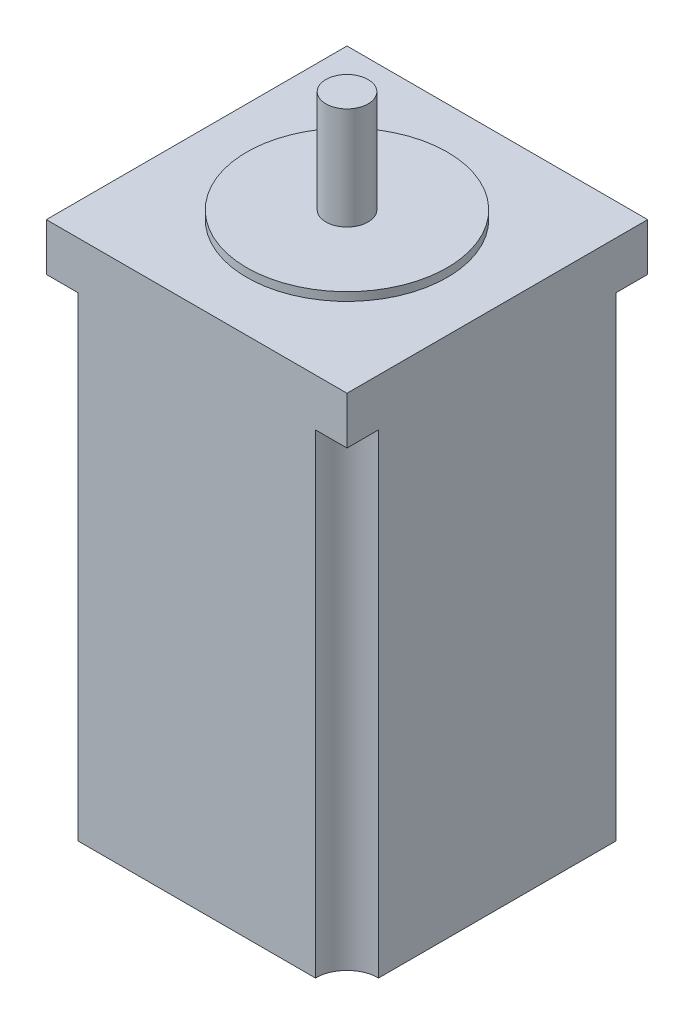
ISO-10303-21;
HEADER;
FILE_DESCRIPTION(('STEP AP214'),'2;1');
FILE_NAME('part.step','',(''),(''),'','','');
FILE_SCHEMA(('AUTOMOTIVE_DESIGN { 1 0 10303 214 1 1 1 1 }'));
ENDSEC;
DATA;
#1=APPLICATION_CONTEXT('core data for automotive mechanical design processes');
#2=APPLICATION_PROTOCOL_DEFINITION('international standard','automotive_design',2000,#1);
#3=PRODUCT_CONTEXT('',#1,'mechanical');
#4=PRODUCT('Part','Part','',(#3));
#5=PRODUCT_RELATED_PRODUCT_CATEGORY('part','',(#4));
#6=PRODUCT_DEFINITION_FORMATION('','',#4);
#7=PRODUCT_DEFINITION_CONTEXT('part definition',#1,'design');
#8=PRODUCT_DEFINITION('design','',#6,#7);
#9=PRODUCT_DEFINITION_SHAPE('','',#8);
#10=(LENGTH_UNIT() NAMED_UNIT(*) SI_UNIT(.MILLI.,.METRE.));
#11=(NAMED_UNIT(*) PLANE_ANGLE_UNIT() SI_UNIT($,.RADIAN.));
#12=(NAMED_UNIT(*) SI_UNIT($,.STERADIAN.) SOLID_ANGLE_UNIT());
#13=UNCERTAINTY_MEASURE_WITH_UNIT(LENGTH_MEASURE(1.E-05),#10,'distance_accuracy_value','');
#14=(GEOMETRIC_REPRESENTATION_CONTEXT(3) GLOBAL_UNCERTAINTY_ASSIGNED_CONTEXT((#13)) GLOBAL_UNIT_ASSIGNED_CONTEXT((#10,
#11,#12)) REPRESENTATION_CONTEXT('',''));
#15=CARTESIAN_POINT('',(0.,0.,0.));
#16=DIRECTION('',(0.,0.,1.));
#17=DIRECTION('',(1.,0.,0.));
#18=AXIS2_PLACEMENT_3D('',#15,#16,#17);
#19=CARTESIAN_POINT('',(-28.5,99.,28.5));
#20=DIRECTION('',(1.,0.,0.));
#21=DIRECTION('',(0.,0.,-1.));
#22=AXIS2_PLACEMENT_3D('',#19,#20,#21);
#23=PLANE('',#22);
#24=DIRECTION('',(0.,0.,1.));
#25=VECTOR('',#24,1.);
#26=CARTESIAN_POINT('',(-28.5,0.,28.5));
#27=LINE('',#26,#25);
#28=CARTESIAN_POINT('',(-28.4999999999998,0.,-22.5000000000003));
#29=VERTEX_POINT('',#28);
#30=CARTESIAN_POINT('',(-28.5,0.,22.5));
#31=VERTEX_POINT('',#30);
#32=EDGE_CURVE('E200',#29,#31,#27,.T.);
#33=ORIENTED_EDGE('',*,*,#32,.T.);
#34=DIRECTION('',(0.,-1.,0.));
#35=VECTOR('',#34,1.);
#36=CARTESIAN_POINT('',(-28.5,90.,22.5));
#37=LINE('',#36,#35);
#38=CARTESIAN_POINT('',(-28.5,90.,22.5));
#39=VERTEX_POINT('',#38);
#40=EDGE_CURVE('E60',#39,#31,#37,.T.);
#41=ORIENTED_EDGE('',*,*,#40,.F.);
#42=DIRECTION('',(0.,0.,-1.));
#43=VECTOR('',#42,1.);
#44=CARTESIAN_POINT('',(-28.5,90.,0.));
#45=LINE('',#44,#43);
#46=CARTESIAN_POINT('',(-28.5,90.,28.5));
#47=VERTEX_POINT('',#46);
#48=EDGE_CURVE('E156',#47,#39,#45,.T.);
#49=ORIENTED_EDGE('',*,*,#48,.F.);
#50=DIRECTION('',(0.,-1.,0.));
#51=VECTOR('',#50,1.);
#52=CARTESIAN_POINT('',(-28.5,99.,28.5));
#53=LINE('',#52,#51);
#54=CARTESIAN_POINT('',(-28.5,99.,28.5));
#55=VERTEX_POINT('',#54);
#56=EDGE_CURVE('E45',#55,#47,#53,.T.);
#57=ORIENTED_EDGE('',*,*,#56,.F.);
#58=DIRECTION('',(0.,0.,1.));
#59=VECTOR('',#58,1.);
#60=CARTESIAN_POINT('',(-28.5,99.,28.5));
#61=LINE('',#60,#59);
#62=CARTESIAN_POINT('',(-28.5,99.,-28.5));
#63=VERTEX_POINT('',#62);
#64=EDGE_CURVE('E203',#63,#55,#61,.T.);
#65=ORIENTED_EDGE('',*,*,#64,.F.);
#66=DIRECTION('',(0.,-1.,0.));
#67=VECTOR('',#66,1.);
#68=CARTESIAN_POINT('',(-28.5,99.,-28.5));
#69=LINE('',#68,#67);
#70=CARTESIAN_POINT('',(-28.4999999999997,90.,-28.5000000000003));
#71=VERTEX_POINT('',#70);
#72=EDGE_CURVE('E213',#63,#71,#69,.T.);
#73=ORIENTED_EDGE('',*,*,#72,.T.);
#74=DIRECTION('',(0.,0.,-1.));
#75=VECTOR('',#74,1.);
#76=CARTESIAN_POINT('',(-28.5,90.,-2.95052207519134E-13));
#77=LINE('',#76,#75);
#78=CARTESIAN_POINT('',(-28.4999999999998,90.,-22.5000000000003));
#79=VERTEX_POINT('',#78);
#80=EDGE_CURVE('E177',#79,#71,#77,.T.);
#81=ORIENTED_EDGE('',*,*,#80,.F.);
#82=DIRECTION('',(0.,-1.,0.));
#83=VECTOR('',#82,1.);
#84=CARTESIAN_POINT('',(-28.4999999999998,90.,-22.5000000000003));
#85=LINE('',#84,#83);
#86=EDGE_CURVE('E166',#79,#29,#85,.T.);
#87=ORIENTED_EDGE('',*,*,#86,.T.);
#88=EDGE_LOOP('',(#33,#41,#49,#57,#65,#73,#81,#87));
#89=FACE_BOUND('',#88,.T.);
#90=ADVANCED_FACE('F38',(#89),#23,.F.);
#91=CARTESIAN_POINT('',(-28.5,99.,28.5));
#92=DIRECTION('',(0.,0.,-1.));
#93=DIRECTION('',(-1.,0.,0.));
#94=AXIS2_PLACEMENT_3D('',#91,#92,#93);
#95=PLANE('',#94);
#96=DIRECTION('',(1.,0.,0.));
#97=VECTOR('',#96,1.);
#98=CARTESIAN_POINT('',(-28.5,0.,28.5));
#99=LINE('',#98,#97);
#100=CARTESIAN_POINT('',(-22.5,0.,28.5));
#101=VERTEX_POINT('',#100);
#102=CARTESIAN_POINT('',(22.4999999999999,0.,28.5));
#103=VERTEX_POINT('',#102);
#104=EDGE_CURVE('E149',#101,#103,#99,.T.);
#105=ORIENTED_EDGE('',*,*,#104,.T.);
#106=DIRECTION('',(0.,-1.,0.));
#107=VECTOR('',#106,1.);
#108=CARTESIAN_POINT('',(22.4999999999999,90.,28.5000000000001));
#109=LINE('',#108,#107);
#110=CARTESIAN_POINT('',(22.4999999999999,90.,28.5000000000001));
#111=VERTEX_POINT('',#110);
#112=EDGE_CURVE('E129',#111,#103,#109,.T.);
#113=ORIENTED_EDGE('',*,*,#112,.F.);
#114=DIRECTION('',(-1.,0.,0.));
#115=VECTOR('',#114,1.);
#116=CARTESIAN_POINT('',(0.,90.,28.5));
#117=LINE('',#116,#115);
#118=CARTESIAN_POINT('',(28.4999999999999,90.,28.5000000000001));
#119=VERTEX_POINT('',#118);
#120=EDGE_CURVE('E136',#119,#111,#117,.T.);
#121=ORIENTED_EDGE('',*,*,#120,.F.);
#122=DIRECTION('',(0.,-1.,0.));
#123=VECTOR('',#122,1.);
#124=CARTESIAN_POINT('',(28.5,99.,28.5));
#125=LINE('',#124,#123);
#126=CARTESIAN_POINT('',(28.5,99.,28.5));
#127=VERTEX_POINT('',#126);
#128=EDGE_CURVE('E226',#127,#119,#125,.T.);
#129=ORIENTED_EDGE('',*,*,#128,.F.);
#130=DIRECTION('',(1.,0.,0.));
#131=VECTOR('',#130,1.);
#132=CARTESIAN_POINT('',(-28.5,99.,28.5));
#133=LINE('',#132,#131);
#134=EDGE_CURVE('E206',#55,#127,#133,.T.);
#135=ORIENTED_EDGE('',*,*,#134,.F.);
#136=ORIENTED_EDGE('',*,*,#56,.T.);
#137=DIRECTION('',(-1.,0.,0.));
#138=VECTOR('',#137,1.);
#139=CARTESIAN_POINT('',(0.,90.,28.5));
#140=LINE('',#139,#138);
#141=CARTESIAN_POINT('',(-22.5,90.,28.5));
#142=VERTEX_POINT('',#141);
#143=EDGE_CURVE('E163',#142,#47,#140,.T.);
#144=ORIENTED_EDGE('',*,*,#143,.F.);
#145=DIRECTION('',(0.,-1.,0.));
#146=VECTOR('',#145,1.);
#147=CARTESIAN_POINT('',(-22.5,90.,28.5));
#148=LINE('',#147,#146);
#149=EDGE_CURVE('E167',#142,#101,#148,.T.);
#150=ORIENTED_EDGE('',*,*,#149,.T.);
#151=EDGE_LOOP('',(#105,#113,#121,#129,#135,#136,#144,#150));
#152=FACE_BOUND('',#151,.T.);
#153=ADVANCED_FACE('F146',(#152),#95,.F.);
#154=CARTESIAN_POINT('',(28.5,99.,28.5));
#155=DIRECTION('',(-1.,0.,0.));
#156=DIRECTION('',(0.,0.,1.));
#157=AXIS2_PLACEMENT_3D('',#154,#155,#156);
#158=PLANE('',#157);
#159=DIRECTION('',(0.,0.,1.));
#160=VECTOR('',#159,1.);
#161=CARTESIAN_POINT('',(28.5,90.,0.));
#162=LINE('',#161,#160);
#163=CARTESIAN_POINT('',(28.4999999999999,90.,22.5000000000001));
#164=VERTEX_POINT('',#163);
#165=EDGE_CURVE('E135',#164,#119,#162,.T.);
#166=ORIENTED_EDGE('',*,*,#165,.F.);
#167=DIRECTION('',(0.,-1.,0.));
#168=VECTOR('',#167,1.);
#169=CARTESIAN_POINT('',(28.4999999999999,90.,22.5000000000001));
#170=LINE('',#169,#168);
#171=CARTESIAN_POINT('',(28.4999999999999,0.,22.5000000000001));
#172=VERTEX_POINT('',#171);
#173=EDGE_CURVE('E132',#164,#172,#170,.T.);
#174=ORIENTED_EDGE('',*,*,#173,.T.);
#175=DIRECTION('',(0.,0.,-1.));
#176=VECTOR('',#175,1.);
#177=CARTESIAN_POINT('',(28.5,0.,28.5));
#178=LINE('',#177,#176);
#179=CARTESIAN_POINT('',(28.5,0.,-22.5));
#180=VERTEX_POINT('',#179);
#181=EDGE_CURVE('E217',#172,#180,#178,.T.);
#182=ORIENTED_EDGE('',*,*,#181,.T.);
#183=DIRECTION('',(0.,-1.,0.));
#184=VECTOR('',#183,1.);
#185=CARTESIAN_POINT('',(28.5,90.,-22.5));
#186=LINE('',#185,#184);
#187=CARTESIAN_POINT('',(28.5,90.,-22.5));
#188=VERTEX_POINT('',#187);
#189=EDGE_CURVE('E195',#188,#180,#186,.T.);
#190=ORIENTED_EDGE('',*,*,#189,.F.);
#191=DIRECTION('',(0.,0.,1.));
#192=VECTOR('',#191,1.);
#193=CARTESIAN_POINT('',(28.5,90.,0.));
#194=LINE('',#193,#192);
#195=CARTESIAN_POINT('',(28.5,90.,-28.5));
#196=VERTEX_POINT('',#195);
#197=EDGE_CURVE('E187',#196,#188,#194,.T.);
#198=ORIENTED_EDGE('',*,*,#197,.F.);
#199=DIRECTION('',(0.,-1.,0.));
#200=VECTOR('',#199,1.);
#201=CARTESIAN_POINT('',(28.5,99.,-28.5));
#202=LINE('',#201,#200);
#203=CARTESIAN_POINT('',(28.5,99.,-28.5));
#204=VERTEX_POINT('',#203);
#205=EDGE_CURVE('E223',#204,#196,#202,.T.);
#206=ORIENTED_EDGE('',*,*,#205,.F.);
#207=DIRECTION('',(0.,0.,-1.));
#208=VECTOR('',#207,1.);
#209=CARTESIAN_POINT('',(28.5,99.,28.5));
#210=LINE('',#209,#208);
#211=EDGE_CURVE('E209',#127,#204,#210,.T.);
#212=ORIENTED_EDGE('',*,*,#211,.F.);
#213=ORIENTED_EDGE('',*,*,#128,.T.);
#214=EDGE_LOOP('',(#166,#174,#182,#190,#198,#206,#212,#213));
#215=FACE_BOUND('',#214,.T.);
#216=ADVANCED_FACE('F240',(#215),#158,.F.);
#217=CARTESIAN_POINT('',(-28.5,99.,-28.5));
#218=DIRECTION('',(0.,0.,1.));
#219=DIRECTION('',(1.,0.,0.));
#220=AXIS2_PLACEMENT_3D('',#217,#218,#219);
#221=PLANE('',#220);
#222=DIRECTION('',(-1.,0.,0.));
#223=VECTOR('',#222,1.);
#224=CARTESIAN_POINT('',(-28.5,0.,-28.5));
#225=LINE('',#224,#223);
#226=CARTESIAN_POINT('',(22.5,0.,-28.5));
#227=VERTEX_POINT('',#226);
#228=CARTESIAN_POINT('',(-22.4999999999997,0.,-28.5));
#229=VERTEX_POINT('',#228);
#230=EDGE_CURVE('E207',#227,#229,#225,.T.);
#231=ORIENTED_EDGE('',*,*,#230,.T.);
#232=DIRECTION('',(0.,-1.,0.));
#233=VECTOR('',#232,1.);
#234=CARTESIAN_POINT('',(-22.4999999999997,90.,-28.5000000000002));
#235=LINE('',#234,#233);
#236=CARTESIAN_POINT('',(-22.4999999999997,90.,-28.5000000000002));
#237=VERTEX_POINT('',#236);
#238=EDGE_CURVE('E52',#237,#229,#235,.T.);
#239=ORIENTED_EDGE('',*,*,#238,.F.);
#240=DIRECTION('',(1.,0.,0.));
#241=VECTOR('',#240,1.);
#242=CARTESIAN_POINT('',(2.95052207519134E-13,90.,-28.5));
#243=LINE('',#242,#241);
#244=EDGE_CURVE('E170',#71,#237,#243,.T.);
#245=ORIENTED_EDGE('',*,*,#244,.F.);
#246=ORIENTED_EDGE('',*,*,#72,.F.);
#247=DIRECTION('',(-1.,0.,0.));
#248=VECTOR('',#247,1.);
#249=CARTESIAN_POINT('',(-28.5,99.,-28.5));
#250=LINE('',#249,#248);
#251=EDGE_CURVE('E211',#204,#63,#250,.T.);
#252=ORIENTED_EDGE('',*,*,#251,.F.);
#253=ORIENTED_EDGE('',*,*,#205,.T.);
#254=DIRECTION('',(1.,0.,0.));
#255=VECTOR('',#254,1.);
#256=CARTESIAN_POINT('',(0.,90.,-28.5));
#257=LINE('',#256,#255);
#258=CARTESIAN_POINT('',(22.5,90.,-28.5));
#259=VERTEX_POINT('',#258);
#260=EDGE_CURVE('E193',#259,#196,#257,.T.);
#261=ORIENTED_EDGE('',*,*,#260,.F.);
#262=DIRECTION('',(0.,-1.,0.));
#263=VECTOR('',#262,1.);
#264=CARTESIAN_POINT('',(22.5,90.,-28.5));
#265=LINE('',#264,#263);
#266=EDGE_CURVE('E197',#259,#227,#265,.T.);
#267=ORIENTED_EDGE('',*,*,#266,.T.);
#268=EDGE_LOOP('',(#231,#239,#245,#246,#252,#253,#261,#267));
#269=FACE_BOUND('',#268,.T.);
#270=ADVANCED_FACE('F249',(#269),#221,.F.);
#271=CARTESIAN_POINT('',(0.,99.,0.));
#272=DIRECTION('',(0.,-1.,0.));
#273=DIRECTION('',(0.,0.,-1.));
#274=AXIS2_PLACEMENT_3D('',#271,#272,#273);
#275=PLANE('',#274);
#276=CARTESIAN_POINT('',(0.,99.,0.));
#277=DIRECTION('',(0.,-1.,0.));
#278=DIRECTION('',(0.,0.,-1.));
#279=AXIS2_PLACEMENT_3D('',#276,#277,#278);
#280=CIRCLE('',#279,19.);
#281=CARTESIAN_POINT('',(0.,99.,-19.));
#282=VERTEX_POINT('',#281);
#283=EDGE_CURVE('E11',#282,#282,#280,.F.);
#284=ORIENTED_EDGE('',*,*,#283,.F.);
#285=EDGE_LOOP('',(#284));
#286=FACE_BOUND('',#285,.T.);
#287=ORIENTED_EDGE('',*,*,#64,.T.);
#288=ORIENTED_EDGE('',*,*,#134,.T.);
#289=ORIENTED_EDGE('',*,*,#211,.T.);
#290=ORIENTED_EDGE('',*,*,#251,.T.);
#291=EDGE_LOOP('',(#287,#288,#289,#290));
#292=FACE_BOUND('',#291,.T.);
#293=ADVANCED_FACE('F260',(#286,#292),#275,.F.);
#294=CARTESIAN_POINT('',(0.,0.,0.));
#295=DIRECTION('',(0.,-1.,0.));
#296=DIRECTION('',(0.,0.,-1.));
#297=AXIS2_PLACEMENT_3D('',#294,#295,#296);
#298=PLANE('',#297);
#299=CARTESIAN_POINT('',(28.4999999999999,0.,28.5000000000001));
#300=DIRECTION('',(0.,-1.,0.));
#301=DIRECTION('',(1.,0.,0.));
#302=AXIS2_PLACEMENT_3D('',#299,#300,#301);
#303=CIRCLE('',#302,5.99999999999999);
#304=EDGE_CURVE('E143',#103,#172,#303,.T.);
#305=ORIENTED_EDGE('',*,*,#304,.F.);
#306=ORIENTED_EDGE('',*,*,#104,.F.);
#307=CARTESIAN_POINT('',(-28.5,0.,28.5));
#308=DIRECTION('',(0.,-1.,0.));
#309=DIRECTION('',(0.,0.,1.));
#310=AXIS2_PLACEMENT_3D('',#307,#308,#309);
#311=CIRCLE('',#310,5.99999999999999);
#312=EDGE_CURVE('E160',#31,#101,#311,.T.);
#313=ORIENTED_EDGE('',*,*,#312,.F.);
#314=ORIENTED_EDGE('',*,*,#32,.F.);
#315=CARTESIAN_POINT('',(-28.4999999999997,0.,-28.5000000000003));
#316=DIRECTION('',(0.,-1.,0.));
#317=DIRECTION('',(-1.,0.,0.));
#318=AXIS2_PLACEMENT_3D('',#315,#316,#317);
#319=CIRCLE('',#318,5.99999999999999);
#320=EDGE_CURVE('E174',#229,#29,#319,.T.);
#321=ORIENTED_EDGE('',*,*,#320,.F.);
#322=ORIENTED_EDGE('',*,*,#230,.F.);
#323=CARTESIAN_POINT('',(28.5,0.,-28.5));
#324=DIRECTION('',(0.,-1.,0.));
#325=DIRECTION('',(0.,0.,-1.));
#326=AXIS2_PLACEMENT_3D('',#323,#324,#325);
#327=CIRCLE('',#326,5.99999999999999);
#328=EDGE_CURVE('E186',#180,#227,#327,.T.);
#329=ORIENTED_EDGE('',*,*,#328,.F.);
#330=ORIENTED_EDGE('',*,*,#181,.F.);
#331=EDGE_LOOP('',(#305,#306,#313,#314,#321,#322,#329,#330));
#332=FACE_BOUND('',#331,.T.);
#333=ADVANCED_FACE('F243',(#332),#298,.T.);
#334=CARTESIAN_POINT('',(28.5,90.,-28.5));
#335=DIRECTION('',(0.,-1.,0.));
#336=DIRECTION('',(0.,0.,-1.));
#337=AXIS2_PLACEMENT_3D('',#334,#335,#336);
#338=CYLINDRICAL_SURFACE('',#337,5.99999999999999);
#339=ORIENTED_EDGE('',*,*,#328,.T.);
#340=ORIENTED_EDGE('',*,*,#266,.F.);
#341=CARTESIAN_POINT('',(28.5,90.,-28.5));
#342=DIRECTION('',(0.,-1.,0.));
#343=DIRECTION('',(0.,0.,-1.));
#344=AXIS2_PLACEMENT_3D('',#341,#342,#343);
#345=CIRCLE('',#344,5.99999999999999);
#346=EDGE_CURVE('E190',#188,#259,#345,.T.);
#347=ORIENTED_EDGE('',*,*,#346,.F.);
#348=ORIENTED_EDGE('',*,*,#189,.T.);
#349=EDGE_LOOP('',(#339,#340,#347,#348));
#350=FACE_BOUND('',#349,.T.);
#351=ADVANCED_FACE('F246',(#350),#338,.F.);
#352=CARTESIAN_POINT('',(0.,90.,0.));
#353=DIRECTION('',(0.,-1.,0.));
#354=DIRECTION('',(0.,0.,-1.));
#355=AXIS2_PLACEMENT_3D('',#352,#353,#354);
#356=PLANE('',#355);
#357=ORIENTED_EDGE('',*,*,#197,.T.);
#358=ORIENTED_EDGE('',*,*,#346,.T.);
#359=ORIENTED_EDGE('',*,*,#260,.T.);
#360=EDGE_LOOP('',(#357,#358,#359));
#361=FACE_BOUND('',#360,.T.);
#362=ADVANCED_FACE('F254',(#361),#356,.T.);
#363=CARTESIAN_POINT('',(-28.4999999999997,90.,-28.5000000000003));
#364=DIRECTION('',(0.,-1.,0.));
#365=DIRECTION('',(0.,0.,-1.));
#366=AXIS2_PLACEMENT_3D('',#363,#364,#365);
#367=CYLINDRICAL_SURFACE('',#366,5.99999999999999);
#368=ORIENTED_EDGE('',*,*,#320,.T.);
#369=ORIENTED_EDGE('',*,*,#86,.F.);
#370=CARTESIAN_POINT('',(-28.4999999999997,90.,-28.5000000000003));
#371=DIRECTION('',(0.,-1.,0.));
#372=DIRECTION('',(-1.,0.,0.));
#373=AXIS2_PLACEMENT_3D('',#370,#371,#372);
#374=CIRCLE('',#373,5.99999999999999);
#375=EDGE_CURVE('E173',#237,#79,#374,.T.);
#376=ORIENTED_EDGE('',*,*,#375,.F.);
#377=ORIENTED_EDGE('',*,*,#238,.T.);
#378=EDGE_LOOP('',(#368,#369,#376,#377));
#379=FACE_BOUND('',#378,.T.);
#380=ADVANCED_FACE('F270',(#379),#367,.F.);
#381=CARTESIAN_POINT('',(0.,90.,0.));
#382=DIRECTION('',(0.,-1.,0.));
#383=DIRECTION('',(-1.,0.,0.));
#384=AXIS2_PLACEMENT_3D('',#381,#382,#383);
#385=PLANE('',#384);
#386=ORIENTED_EDGE('',*,*,#244,.T.);
#387=ORIENTED_EDGE('',*,*,#375,.T.);
#388=ORIENTED_EDGE('',*,*,#80,.T.);
#389=EDGE_LOOP('',(#386,#387,#388));
#390=FACE_BOUND('',#389,.T.);
#391=ADVANCED_FACE('F272',(#390),#385,.T.);
#392=CARTESIAN_POINT('',(-28.5,90.,28.5));
#393=DIRECTION('',(0.,-1.,0.));
#394=DIRECTION('',(0.,0.,-1.));
#395=AXIS2_PLACEMENT_3D('',#392,#393,#394);
#396=CYLINDRICAL_SURFACE('',#395,5.99999999999999);
#397=ORIENTED_EDGE('',*,*,#312,.T.);
#398=ORIENTED_EDGE('',*,*,#149,.F.);
#399=CARTESIAN_POINT('',(-28.5,90.,28.5));
#400=DIRECTION('',(0.,-1.,0.));
#401=DIRECTION('',(0.,0.,1.));
#402=AXIS2_PLACEMENT_3D('',#399,#400,#401);
#403=CIRCLE('',#402,5.99999999999999);
#404=EDGE_CURVE('E159',#39,#142,#403,.T.);
#405=ORIENTED_EDGE('',*,*,#404,.F.);
#406=ORIENTED_EDGE('',*,*,#40,.T.);
#407=EDGE_LOOP('',(#397,#398,#405,#406));
#408=FACE_BOUND('',#407,.T.);
#409=ADVANCED_FACE('F267',(#408),#396,.F.);
#410=CARTESIAN_POINT('',(0.,90.,0.));
#411=DIRECTION('',(0.,-1.,0.));
#412=DIRECTION('',(0.,0.,1.));
#413=AXIS2_PLACEMENT_3D('',#410,#411,#412);
#414=PLANE('',#413);
#415=ORIENTED_EDGE('',*,*,#48,.T.);
#416=ORIENTED_EDGE('',*,*,#404,.T.);
#417=ORIENTED_EDGE('',*,*,#143,.T.);
#418=EDGE_LOOP('',(#415,#416,#417));
#419=FACE_BOUND('',#418,.T.);
#420=ADVANCED_FACE('F266',(#419),#414,.T.);
#421=CARTESIAN_POINT('',(28.4999999999999,90.,28.5000000000001));
#422=DIRECTION('',(0.,-1.,0.));
#423=DIRECTION('',(0.,0.,-1.));
#424=AXIS2_PLACEMENT_3D('',#421,#422,#423);
#425=CYLINDRICAL_SURFACE('',#424,5.99999999999999);
#426=ORIENTED_EDGE('',*,*,#304,.T.);
#427=ORIENTED_EDGE('',*,*,#173,.F.);
#428=CARTESIAN_POINT('',(28.4999999999999,90.,28.5000000000001));
#429=DIRECTION('',(0.,-1.,0.));
#430=DIRECTION('',(1.,0.,0.));
#431=AXIS2_PLACEMENT_3D('',#428,#429,#430);
#432=CIRCLE('',#431,5.99999999999999);
#433=EDGE_CURVE('E125',#111,#164,#432,.T.);
#434=ORIENTED_EDGE('',*,*,#433,.F.);
#435=ORIENTED_EDGE('',*,*,#112,.T.);
#436=EDGE_LOOP('',(#426,#427,#434,#435));
#437=FACE_BOUND('',#436,.T.);
#438=ADVANCED_FACE('F127',(#437),#425,.F.);
#439=CARTESIAN_POINT('',(0.,90.,0.));
#440=DIRECTION('',(0.,-1.,0.));
#441=DIRECTION('',(1.,0.,0.));
#442=AXIS2_PLACEMENT_3D('',#439,#440,#441);
#443=PLANE('',#442);
#444=ORIENTED_EDGE('',*,*,#120,.T.);
#445=ORIENTED_EDGE('',*,*,#433,.T.);
#446=ORIENTED_EDGE('',*,*,#165,.T.);
#447=EDGE_LOOP('',(#444,#445,#446));
#448=FACE_BOUND('',#447,.T.);
#449=ADVANCED_FACE('F139',(#448),#443,.T.);
#450=CARTESIAN_POINT('',(0.,100.6,0.));
#451=DIRECTION('',(0.,-1.,0.));
#452=DIRECTION('',(0.,0.,-1.));
#453=AXIS2_PLACEMENT_3D('',#450,#451,#452);
#454=CYLINDRICAL_SURFACE('',#453,19.);
#455=CARTESIAN_POINT('',(0.,100.6,0.));
#456=DIRECTION('',(0.,1.,0.));
#457=DIRECTION('',(0.,0.,1.));
#458=AXIS2_PLACEMENT_3D('',#455,#456,#457);
#459=CIRCLE('',#458,19.);
#460=CARTESIAN_POINT('',(0.,100.6,19.));
#461=VERTEX_POINT('',#460);
#462=EDGE_CURVE('E230',#461,#461,#459,.T.);
#463=ORIENTED_EDGE('',*,*,#462,.F.);
#464=EDGE_LOOP('',(#463));
#465=FACE_BOUND('',#464,.T.);
#466=ORIENTED_EDGE('',*,*,#283,.T.);
#467=EDGE_LOOP('',(#466));
#468=FACE_BOUND('',#467,.T.);
#469=ADVANCED_FACE('F311',(#465,#468),#454,.T.);
#470=CARTESIAN_POINT('',(0.,100.6,0.));
#471=DIRECTION('',(0.,1.,0.));
#472=DIRECTION('',(0.,0.,1.));
#473=AXIS2_PLACEMENT_3D('',#470,#471,#472);
#474=PLANE('',#473);
#475=CARTESIAN_POINT('',(0.,100.6,0.));
#476=DIRECTION('',(0.,1.,0.));
#477=DIRECTION('',(0.,0.,1.));
#478=AXIS2_PLACEMENT_3D('',#475,#476,#477);
#479=CIRCLE('',#478,4.);
#480=CARTESIAN_POINT('',(0.,100.6,-4.));
#481=VERTEX_POINT('',#480);
#482=EDGE_CURVE('E180',#481,#481,#479,.T.);
#483=ORIENTED_EDGE('',*,*,#482,.F.);
#484=EDGE_LOOP('',(#483));
#485=FACE_BOUND('',#484,.T.);
#486=ORIENTED_EDGE('',*,*,#462,.T.);
#487=EDGE_LOOP('',(#486));
#488=FACE_BOUND('',#487,.T.);
#489=ADVANCED_FACE('F306',(#485,#488),#474,.T.);
#490=CARTESIAN_POINT('',(0.,120.,0.));
#491=DIRECTION('',(0.,1.,0.));
#492=DIRECTION('',(0.,0.,1.));
#493=AXIS2_PLACEMENT_3D('',#490,#491,#492);
#494=PLANE('',#493);
#495=CARTESIAN_POINT('',(0.,120.,0.));
#496=DIRECTION('',(0.,1.,0.));
#497=DIRECTION('',(0.,0.,1.));
#498=AXIS2_PLACEMENT_3D('',#495,#496,#497);
#499=CIRCLE('',#498,4.);
#500=CARTESIAN_POINT('',(0.,120.,-4.));
#501=VERTEX_POINT('',#500);
#502=EDGE_CURVE('E151',#501,#501,#499,.T.);
#503=ORIENTED_EDGE('',*,*,#502,.T.);
#504=EDGE_LOOP('',(#503));
#505=FACE_BOUND('',#504,.T.);
#506=ADVANCED_FACE('F304',(#505),#494,.T.);
#507=CARTESIAN_POINT('',(0.,120.,0.));
#508=DIRECTION('',(0.,-1.,0.));
#509=DIRECTION('',(0.,0.,-1.));
#510=AXIS2_PLACEMENT_3D('',#507,#508,#509);
#511=CYLINDRICAL_SURFACE('',#510,4.);
#512=CARTESIAN_POINT('',(0.,100.6,-4.));
#513=CARTESIAN_POINT('',(0.,100.802083333333,-4.));
#514=CARTESIAN_POINT('',(0.,101.004166666667,-4.));
#515=CARTESIAN_POINT('',(0.,101.408333333333,-4.));
#516=CARTESIAN_POINT('',(0.,101.610416666667,-4.));
#517=CARTESIAN_POINT('',(0.,102.014583333333,-4.));
#518=CARTESIAN_POINT('',(0.,102.216666666667,-4.));
#519=CARTESIAN_POINT('',(0.,102.620833333333,-4.));
#520=CARTESIAN_POINT('',(0.,102.822916666667,-4.));
#521=CARTESIAN_POINT('',(0.,103.227083333333,-4.));
#522=CARTESIAN_POINT('',(0.,103.429166666667,-4.));
#523=CARTESIAN_POINT('',(0.,103.833333333333,-4.));
#524=CARTESIAN_POINT('',(0.,104.035416666667,-4.));
#525=CARTESIAN_POINT('',(0.,104.439583333333,-4.));
#526=CARTESIAN_POINT('',(0.,104.641666666667,-4.));
#527=CARTESIAN_POINT('',(0.,105.045833333333,-4.));
#528=CARTESIAN_POINT('',(0.,105.247916666667,-4.));
#529=CARTESIAN_POINT('',(0.,105.652083333333,-4.));
#530=CARTESIAN_POINT('',(0.,105.854166666667,-4.));
#531=CARTESIAN_POINT('',(0.,106.258333333333,-4.));
#532=CARTESIAN_POINT('',(0.,106.460416666667,-4.));
#533=CARTESIAN_POINT('',(0.,106.864583333333,-4.));
#534=CARTESIAN_POINT('',(0.,107.066666666667,-4.));
#535=CARTESIAN_POINT('',(0.,107.470833333333,-4.));
#536=CARTESIAN_POINT('',(0.,107.672916666667,-4.));
#537=CARTESIAN_POINT('',(0.,108.077083333333,-4.));
#538=CARTESIAN_POINT('',(0.,108.279166666667,-4.));
#539=CARTESIAN_POINT('',(0.,108.683333333333,-4.));
#540=CARTESIAN_POINT('',(0.,108.885416666667,-4.));
#541=CARTESIAN_POINT('',(0.,109.289583333333,-4.));
#542=CARTESIAN_POINT('',(0.,109.491666666667,-4.));
#543=CARTESIAN_POINT('',(0.,109.895833333333,-4.));
#544=CARTESIAN_POINT('',(0.,110.097916666667,-4.));
#545=CARTESIAN_POINT('',(0.,110.502083333333,-4.));
#546=CARTESIAN_POINT('',(0.,110.704166666667,-4.));
#547=CARTESIAN_POINT('',(0.,111.108333333333,-4.));
#548=CARTESIAN_POINT('',(0.,111.310416666667,-4.));
#549=CARTESIAN_POINT('',(0.,111.714583333333,-4.));
#550=CARTESIAN_POINT('',(0.,111.916666666667,-4.));
#551=CARTESIAN_POINT('',(0.,112.320833333333,-4.));
#552=CARTESIAN_POINT('',(0.,112.522916666667,-4.));
#553=CARTESIAN_POINT('',(0.,112.927083333333,-4.));
#554=CARTESIAN_POINT('',(0.,113.129166666667,-4.));
#555=CARTESIAN_POINT('',(0.,113.533333333333,-4.));
#556=CARTESIAN_POINT('',(0.,113.735416666667,-4.));
#557=CARTESIAN_POINT('',(0.,114.139583333333,-4.));
#558=CARTESIAN_POINT('',(0.,114.341666666667,-4.));
#559=CARTESIAN_POINT('',(0.,114.745833333333,-4.));
#560=CARTESIAN_POINT('',(0.,114.947916666667,-4.));
#561=CARTESIAN_POINT('',(0.,115.352083333333,-4.));
#562=CARTESIAN_POINT('',(0.,115.554166666667,-4.));
#563=CARTESIAN_POINT('',(0.,115.958333333333,-4.));
#564=CARTESIAN_POINT('',(0.,116.160416666667,-4.));
#565=CARTESIAN_POINT('',(0.,116.564583333333,-4.));
#566=CARTESIAN_POINT('',(0.,116.766666666667,-4.));
#567=CARTESIAN_POINT('',(0.,117.170833333333,-4.));
#568=CARTESIAN_POINT('',(0.,117.372916666667,-4.));
#569=CARTESIAN_POINT('',(0.,117.777083333333,-4.));
#570=CARTESIAN_POINT('',(0.,117.979166666667,-4.));
#571=CARTESIAN_POINT('',(0.,118.383333333333,-4.));
#572=CARTESIAN_POINT('',(0.,118.585416666667,-4.));
#573=CARTESIAN_POINT('',(0.,118.989583333333,-4.));
#574=CARTESIAN_POINT('',(0.,119.191666666667,-4.));
#575=CARTESIAN_POINT('',(0.,119.595833333333,-4.));
#576=CARTESIAN_POINT('',(0.,119.797916666667,-4.));
#577=CARTESIAN_POINT('',(0.,120.,-4.));
#578=B_SPLINE_CURVE_WITH_KNOTS('',3,(#512,#513,#514,#515,#516,#517,#518,#519,#520,#521,#522,
#523,#524,#525,#526,#527,#528,#529,#530,#531,#532,#533,#534,#535,#536,#537,#538,#539,#540,#541,
#542,#543,#544,#545,#546,#547,#548,#549,#550,#551,#552,#553,#554,#555,#556,#557,#558,#559,#560,
#561,#562,#563,#564,#565,#566,#567,#568,#569,#570,#571,#572,#573,#574,#575,#576,#577),
.UNSPECIFIED.,.F.,.F.,(4,2,2,2,2,2,2,2,2,2,2,2,2,2,2,2,2,2,2,2,2,2,2,2,2,2,2,2,2,2,2,2,4),(0.,
0.606249999999989,1.21249999999999,1.81874999999999,2.425,3.03125,3.6375,4.24374999999999,
4.84999999999999,5.45625,6.0625,6.66875,7.27499999999999,7.88124999999999,8.4875,9.09375,9.7,
10.30625,10.9125,11.51875,12.125,12.73125,13.3375,13.94375,14.55,15.15625,15.7625,16.36875,
16.975,17.58125,18.1875,18.79375,19.4),.UNSPECIFIED.);
#579=EDGE_CURVE('BSEAM301',#481,#501,#578,.T.);
#580=ORIENTED_EDGE('',*,*,#482,.T.);
#581=ORIENTED_EDGE('',*,*,#502,.F.);
#582=ORIENTED_EDGE('',*,*,#579,.T.);
#583=ORIENTED_EDGE('',*,*,#579,.F.);
#584=EDGE_LOOP('',(#580,#582,#581,#583));
#585=FACE_BOUND('',#584,.T.);
#586=ADVANCED_FACE('F301',(#585),#511,.T.);
#587=CLOSED_SHELL('',(#90,#153,#216,#270,#293,#333,#351,#362,#380,#391,#409,#420,#438,#449,#469,
#489,#506,#586));
#588=MANIFOLD_SOLID_BREP('B2',#587);
#589=ADVANCED_BREP_SHAPE_REPRESENTATION('',(#18,#588),#14);
#590=SHAPE_DEFINITION_REPRESENTATION(#9,#589);
ENDSEC;
END-ISO-10303-21;
